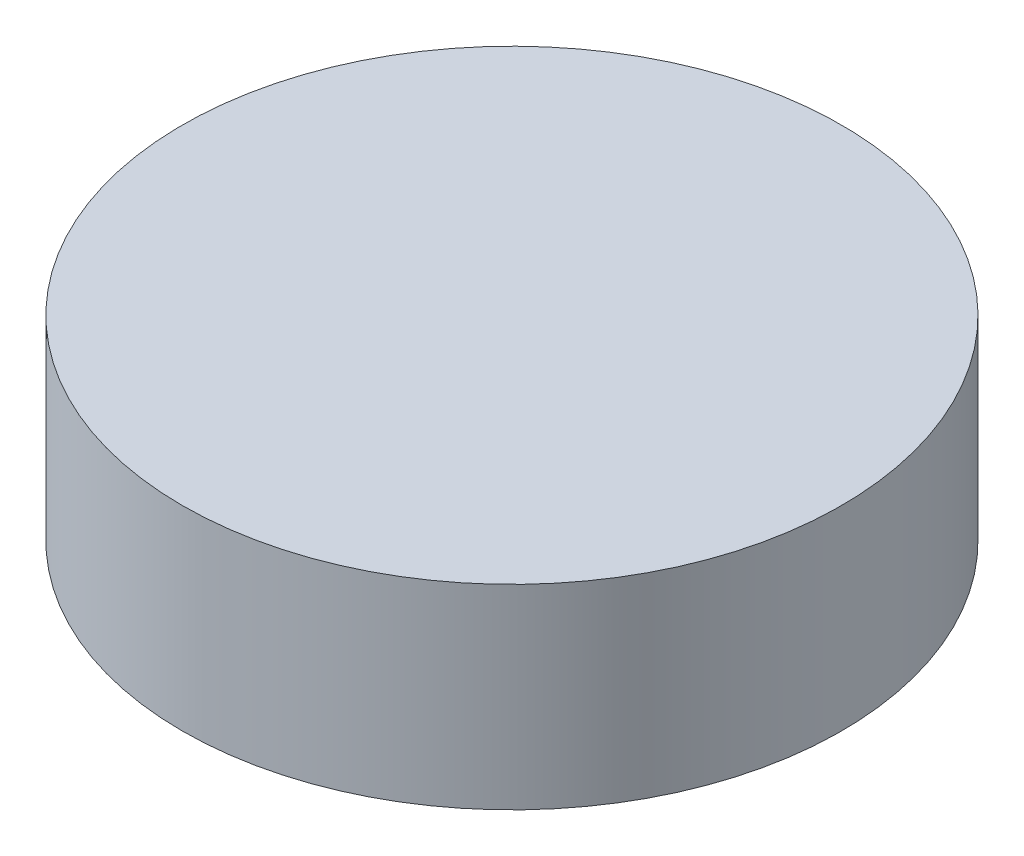
ISO-10303-21;
HEADER;
FILE_DESCRIPTION(('STEP AP214'),'2;1');
FILE_NAME('part.step','',(''),(''),'','','');
FILE_SCHEMA(('AUTOMOTIVE_DESIGN { 1 0 10303 214 1 1 1 1 }'));
ENDSEC;
DATA;
#1=APPLICATION_CONTEXT('core data for automotive mechanical design processes');
#2=APPLICATION_PROTOCOL_DEFINITION('international standard','automotive_design',2000,#1);
#3=PRODUCT_CONTEXT('',#1,'mechanical');
#4=PRODUCT('Part','Part','',(#3));
#5=PRODUCT_RELATED_PRODUCT_CATEGORY('part','',(#4));
#6=PRODUCT_DEFINITION_FORMATION('','',#4);
#7=PRODUCT_DEFINITION_CONTEXT('part definition',#1,'design');
#8=PRODUCT_DEFINITION('design','',#6,#7);
#9=PRODUCT_DEFINITION_SHAPE('','',#8);
#10=(LENGTH_UNIT() NAMED_UNIT(*) SI_UNIT(.MILLI.,.METRE.));
#11=(NAMED_UNIT(*) PLANE_ANGLE_UNIT() SI_UNIT($,.RADIAN.));
#12=(NAMED_UNIT(*) SI_UNIT($,.STERADIAN.) SOLID_ANGLE_UNIT());
#13=UNCERTAINTY_MEASURE_WITH_UNIT(LENGTH_MEASURE(1.E-05),#10,'distance_accuracy_value','');
#14=(GEOMETRIC_REPRESENTATION_CONTEXT(3) GLOBAL_UNCERTAINTY_ASSIGNED_CONTEXT((#13)) GLOBAL_UNIT_ASSIGNED_CONTEXT((#10,
#11,#12)) REPRESENTATION_CONTEXT('',''));
#15=CARTESIAN_POINT('',(0.,0.,0.));
#16=DIRECTION('',(0.,0.,1.));
#17=DIRECTION('',(1.,0.,0.));
#18=AXIS2_PLACEMENT_3D('',#15,#16,#17);
#19=CARTESIAN_POINT('',(0.,40.,0.));
#20=DIRECTION('',(0.,-1.,0.));
#21=DIRECTION('',(0.,0.,-1.));
#22=AXIS2_PLACEMENT_3D('',#19,#20,#21);
#23=CYLINDRICAL_SURFACE('',#22,67.5);
#24=CARTESIAN_POINT('',(0.,40.,0.));
#25=DIRECTION('',(0.,1.,0.));
#26=DIRECTION('',(0.,0.,1.));
#27=AXIS2_PLACEMENT_3D('',#24,#25,#26);
#28=CIRCLE('',#27,67.5);
#29=CARTESIAN_POINT('',(0.,40.,67.5));
#30=VERTEX_POINT('',#29);
#31=EDGE_CURVE('E10',#30,#30,#28,.T.);
#32=ORIENTED_EDGE('',*,*,#31,.F.);
#33=EDGE_LOOP('',(#32));
#34=FACE_BOUND('',#33,.T.);
#35=CARTESIAN_POINT('',(0.,0.,0.));
#36=DIRECTION('',(0.,1.,0.));
#37=DIRECTION('',(0.,0.,1.));
#38=AXIS2_PLACEMENT_3D('',#35,#36,#37);
#39=CIRCLE('',#38,67.5);
#40=CARTESIAN_POINT('',(0.,0.,67.5));
#41=VERTEX_POINT('',#40);
#42=EDGE_CURVE('E44',#41,#41,#39,.T.);
#43=ORIENTED_EDGE('',*,*,#42,.T.);
#44=EDGE_LOOP('',(#43));
#45=FACE_BOUND('',#44,.T.);
#46=ADVANCED_FACE('F41',(#34,#45),#23,.T.);
#47=CARTESIAN_POINT('',(0.,40.,0.));
#48=DIRECTION('',(0.,1.,0.));
#49=DIRECTION('',(0.,0.,1.));
#50=AXIS2_PLACEMENT_3D('',#47,#48,#49);
#51=PLANE('',#50);
#52=ORIENTED_EDGE('',*,*,#31,.T.);
#53=EDGE_LOOP('',(#52));
#54=FACE_BOUND('',#53,.T.);
#55=ADVANCED_FACE('F58',(#54),#51,.T.);
#56=CARTESIAN_POINT('',(0.,0.,0.));
#57=DIRECTION('',(0.,1.,0.));
#58=DIRECTION('',(0.,0.,1.));
#59=AXIS2_PLACEMENT_3D('',#56,#57,#58);
#60=PLANE('',#59);
#61=ORIENTED_EDGE('',*,*,#42,.F.);
#62=EDGE_LOOP('',(#61));
#63=FACE_BOUND('',#62,.T.);
#64=ADVANCED_FACE('F56',(#63),#60,.F.);
#65=CLOSED_SHELL('',(#46,#55,#64));
#66=MANIFOLD_SOLID_BREP('B2',#65);
#67=ADVANCED_BREP_SHAPE_REPRESENTATION('',(#18,#66),#14);
#68=SHAPE_DEFINITION_REPRESENTATION(#9,#67);
ENDSEC;
END-ISO-10303-21;
